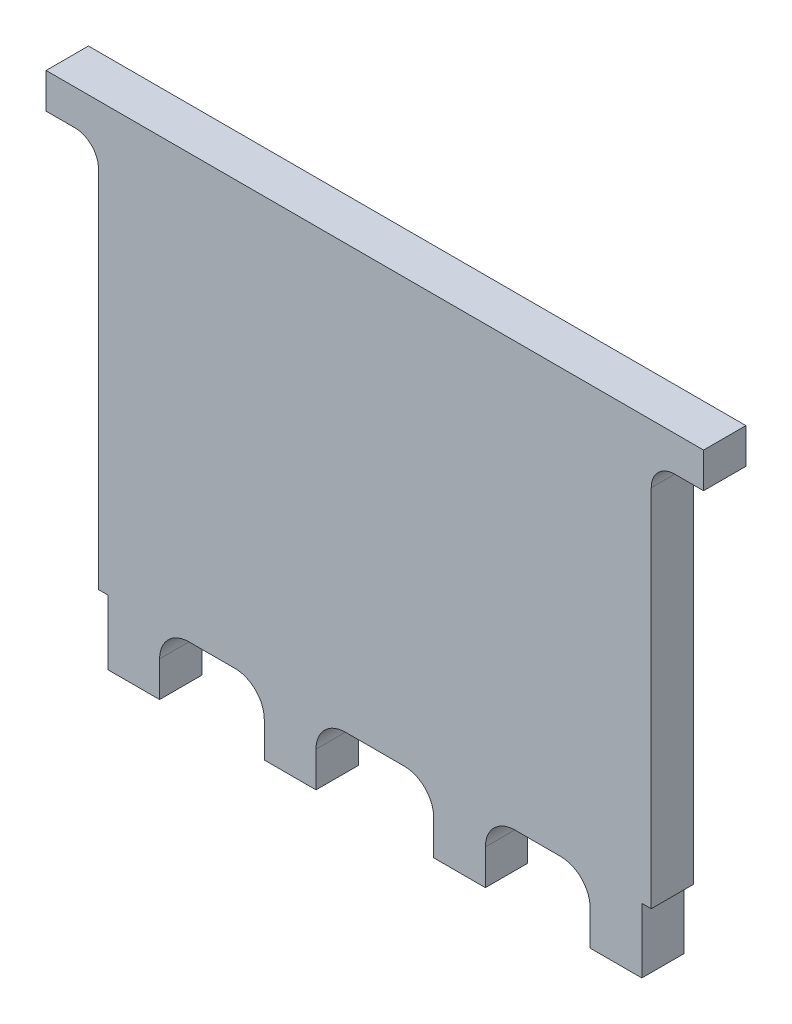
ISO-10303-21;
HEADER;
FILE_DESCRIPTION(('STEP AP214'),'2;1');
FILE_NAME('part.step','',(''),(''),'','','');
FILE_SCHEMA(('AUTOMOTIVE_DESIGN { 1 0 10303 214 1 1 1 1 }'));
ENDSEC;
DATA;
#1=APPLICATION_CONTEXT('core data for automotive mechanical design processes');
#2=APPLICATION_PROTOCOL_DEFINITION('international standard','automotive_design',2000,#1);
#3=PRODUCT_CONTEXT('',#1,'mechanical');
#4=PRODUCT('Part','Part','',(#3));
#5=PRODUCT_RELATED_PRODUCT_CATEGORY('part','',(#4));
#6=PRODUCT_DEFINITION_FORMATION('','',#4);
#7=PRODUCT_DEFINITION_CONTEXT('part definition',#1,'design');
#8=PRODUCT_DEFINITION('design','',#6,#7);
#9=PRODUCT_DEFINITION_SHAPE('','',#8);
#10=(LENGTH_UNIT() NAMED_UNIT(*) SI_UNIT(.MILLI.,.METRE.));
#11=(NAMED_UNIT(*) PLANE_ANGLE_UNIT() SI_UNIT($,.RADIAN.));
#12=(NAMED_UNIT(*) SI_UNIT($,.STERADIAN.) SOLID_ANGLE_UNIT());
#13=UNCERTAINTY_MEASURE_WITH_UNIT(LENGTH_MEASURE(1.E-05),#10,'distance_accuracy_value','');
#14=(GEOMETRIC_REPRESENTATION_CONTEXT(3) GLOBAL_UNCERTAINTY_ASSIGNED_CONTEXT((#13)) GLOBAL_UNIT_ASSIGNED_CONTEXT((#10,
#11,#12)) REPRESENTATION_CONTEXT('',''));
#15=CARTESIAN_POINT('',(0.,0.,0.));
#16=DIRECTION('',(0.,0.,1.));
#17=DIRECTION('',(1.,0.,0.));
#18=AXIS2_PLACEMENT_3D('',#15,#16,#17);
#19=CARTESIAN_POINT('',(2.55,0.975,-0.01));
#20=DIRECTION('',(0.,0.,1.));
#21=DIRECTION('',(1.,0.,0.));
#22=AXIS2_PLACEMENT_3D('',#19,#20,#21);
#23=PLANE('',#22);
#24=DIRECTION('',(0.,-1.,0.));
#25=VECTOR('',#24,1.);
#26=CARTESIAN_POINT('',(2.795,1.475,-0.01));
#27=LINE('',#26,#25);
#28=CARTESIAN_POINT('',(2.795,1.475,-0.01));
#29=VERTEX_POINT('',#28);
#30=CARTESIAN_POINT('',(2.795,1.175,-0.01));
#31=VERTEX_POINT('',#30);
#32=EDGE_CURVE('E236',#29,#31,#27,.T.);
#33=ORIENTED_EDGE('',*,*,#32,.T.);
#34=DIRECTION('',(1.,0.,0.));
#35=VECTOR('',#34,1.);
#36=CARTESIAN_POINT('',(2.55,1.175,-0.01));
#37=LINE('',#36,#35);
#38=CARTESIAN_POINT('',(2.55,1.175,-0.01));
#39=VERTEX_POINT('',#38);
#40=EDGE_CURVE('E228',#39,#31,#37,.T.);
#41=ORIENTED_EDGE('',*,*,#40,.F.);
#42=CARTESIAN_POINT('',(2.55,0.975,-0.01));
#43=DIRECTION('',(0.,0.,1.));
#44=DIRECTION('',(1.,0.,0.));
#45=AXIS2_PLACEMENT_3D('',#42,#43,#44);
#46=CIRCLE('',#45,0.2);
#47=CARTESIAN_POINT('',(2.35,0.975,-0.01));
#48=VERTEX_POINT('',#47);
#49=EDGE_CURVE('E19',#48,#39,#46,.F.);
#50=ORIENTED_EDGE('',*,*,#49,.F.);
#51=DIRECTION('',(0.,-1.,0.));
#52=VECTOR('',#51,1.);
#53=CARTESIAN_POINT('',(2.35,0.975,-0.01));
#54=LINE('',#53,#52);
#55=CARTESIAN_POINT('',(2.35,-2.125,-0.01));
#56=VERTEX_POINT('',#55);
#57=EDGE_CURVE('E153',#48,#56,#54,.T.);
#58=ORIENTED_EDGE('',*,*,#57,.T.);
#59=DIRECTION('',(1.,0.,0.));
#60=VECTOR('',#59,1.);
#61=CARTESIAN_POINT('',(2.27,-2.125,-0.01));
#62=LINE('',#61,#60);
#63=CARTESIAN_POINT('',(2.27,-2.125,-0.01));
#64=VERTEX_POINT('',#63);
#65=EDGE_CURVE('E427',#56,#64,#62,.F.);
#66=ORIENTED_EDGE('',*,*,#65,.T.);
#67=DIRECTION('',(0.,1.,0.));
#68=VECTOR('',#67,1.);
#69=CARTESIAN_POINT('',(2.27,-2.675,-0.01));
#70=LINE('',#69,#68);
#71=CARTESIAN_POINT('',(2.27,-2.675,-0.01));
#72=VERTEX_POINT('',#71);
#73=EDGE_CURVE('E246',#64,#72,#70,.F.);
#74=ORIENTED_EDGE('',*,*,#73,.T.);
#75=DIRECTION('',(1.,0.,0.));
#76=VECTOR('',#75,1.);
#77=CARTESIAN_POINT('',(2.27,-2.675,-0.01));
#78=LINE('',#77,#76);
#79=CARTESIAN_POINT('',(1.83,-2.675,-0.01));
#80=VERTEX_POINT('',#79);
#81=EDGE_CURVE('E252',#72,#80,#78,.F.);
#82=ORIENTED_EDGE('',*,*,#81,.T.);
#83=DIRECTION('',(0.,1.,0.));
#84=VECTOR('',#83,1.);
#85=CARTESIAN_POINT('',(1.83,-2.675,-0.01));
#86=LINE('',#85,#84);
#87=CARTESIAN_POINT('',(1.83,-2.375,-0.01));
#88=VERTEX_POINT('',#87);
#89=EDGE_CURVE('E257',#80,#88,#86,.T.);
#90=ORIENTED_EDGE('',*,*,#89,.T.);
#91=CARTESIAN_POINT('',(1.58,-2.375,-0.01));
#92=DIRECTION('',(0.,0.,1.));
#93=DIRECTION('',(1.,0.,0.));
#94=AXIS2_PLACEMENT_3D('',#91,#92,#93);
#95=CIRCLE('',#94,0.25);
#96=CARTESIAN_POINT('',(1.58,-2.125,-0.01));
#97=VERTEX_POINT('',#96);
#98=EDGE_CURVE('E380',#88,#97,#95,.T.);
#99=ORIENTED_EDGE('',*,*,#98,.T.);
#100=DIRECTION('',(-1.,0.,0.));
#101=VECTOR('',#100,1.);
#102=CARTESIAN_POINT('',(1.58,-2.125,-0.01));
#103=LINE('',#102,#101);
#104=CARTESIAN_POINT('',(1.19,-2.125,-0.01));
#105=VERTEX_POINT('',#104);
#106=EDGE_CURVE('E262',#97,#105,#103,.T.);
#107=ORIENTED_EDGE('',*,*,#106,.T.);
#108=CARTESIAN_POINT('',(1.19,-2.375,-0.01));
#109=DIRECTION('',(0.,0.,1.));
#110=DIRECTION('',(1.,0.,0.));
#111=AXIS2_PLACEMENT_3D('',#108,#109,#110);
#112=CIRCLE('',#111,0.25);
#113=CARTESIAN_POINT('',(0.94,-2.375,-0.01));
#114=VERTEX_POINT('',#113);
#115=EDGE_CURVE('E382',#105,#114,#112,.T.);
#116=ORIENTED_EDGE('',*,*,#115,.T.);
#117=DIRECTION('',(0.,1.,0.));
#118=VECTOR('',#117,1.);
#119=CARTESIAN_POINT('',(0.94,-2.375,-0.01));
#120=LINE('',#119,#118);
#121=CARTESIAN_POINT('',(0.94,-2.675,-0.01));
#122=VERTEX_POINT('',#121);
#123=EDGE_CURVE('E266',#114,#122,#120,.F.);
#124=ORIENTED_EDGE('',*,*,#123,.T.);
#125=DIRECTION('',(1.,0.,0.));
#126=VECTOR('',#125,1.);
#127=CARTESIAN_POINT('',(0.94,-2.675,-0.01));
#128=LINE('',#127,#126);
#129=CARTESIAN_POINT('',(0.5,-2.675,-0.01));
#130=VERTEX_POINT('',#129);
#131=EDGE_CURVE('E272',#122,#130,#128,.F.);
#132=ORIENTED_EDGE('',*,*,#131,.T.);
#133=DIRECTION('',(0.,1.,0.));
#134=VECTOR('',#133,1.);
#135=CARTESIAN_POINT('',(0.5,-2.675,-0.01));
#136=LINE('',#135,#134);
#137=CARTESIAN_POINT('',(0.5,-2.375,-0.01));
#138=VERTEX_POINT('',#137);
#139=EDGE_CURVE('E277',#130,#138,#136,.T.);
#140=ORIENTED_EDGE('',*,*,#139,.T.);
#141=CARTESIAN_POINT('',(0.25,-2.375,-0.01));
#142=DIRECTION('',(0.,0.,1.));
#143=DIRECTION('',(1.,0.,0.));
#144=AXIS2_PLACEMENT_3D('',#141,#142,#143);
#145=CIRCLE('',#144,0.25);
#146=CARTESIAN_POINT('',(0.25,-2.125,-0.01));
#147=VERTEX_POINT('',#146);
#148=EDGE_CURVE('E384',#138,#147,#145,.T.);
#149=ORIENTED_EDGE('',*,*,#148,.T.);
#150=DIRECTION('',(1.,0.,0.));
#151=VECTOR('',#150,1.);
#152=CARTESIAN_POINT('',(0.25,-2.125,-0.01));
#153=LINE('',#152,#151);
#154=CARTESIAN_POINT('',(-0.25,-2.125,-0.01));
#155=VERTEX_POINT('',#154);
#156=EDGE_CURVE('E282',#147,#155,#153,.F.);
#157=ORIENTED_EDGE('',*,*,#156,.T.);
#158=CARTESIAN_POINT('',(-0.25,-2.375,-0.01));
#159=DIRECTION('',(0.,0.,1.));
#160=DIRECTION('',(1.,0.,0.));
#161=AXIS2_PLACEMENT_3D('',#158,#159,#160);
#162=CIRCLE('',#161,0.25);
#163=CARTESIAN_POINT('',(-0.5,-2.375,-0.01));
#164=VERTEX_POINT('',#163);
#165=EDGE_CURVE('E386',#155,#164,#162,.T.);
#166=ORIENTED_EDGE('',*,*,#165,.T.);
#167=DIRECTION('',(0.,-1.,0.));
#168=VECTOR('',#167,1.);
#169=CARTESIAN_POINT('',(-0.5,-2.375,-0.01));
#170=LINE('',#169,#168);
#171=CARTESIAN_POINT('',(-0.5,-2.675,-0.01));
#172=VERTEX_POINT('',#171);
#173=EDGE_CURVE('E286',#164,#172,#170,.T.);
#174=ORIENTED_EDGE('',*,*,#173,.T.);
#175=DIRECTION('',(1.,0.,0.));
#176=VECTOR('',#175,1.);
#177=CARTESIAN_POINT('',(-0.5,-2.675,-0.01));
#178=LINE('',#177,#176);
#179=CARTESIAN_POINT('',(-0.94,-2.675,-0.01));
#180=VERTEX_POINT('',#179);
#181=EDGE_CURVE('E292',#172,#180,#178,.F.);
#182=ORIENTED_EDGE('',*,*,#181,.T.);
#183=DIRECTION('',(0.,1.,0.));
#184=VECTOR('',#183,1.);
#185=CARTESIAN_POINT('',(-0.94,-2.675,-0.01));
#186=LINE('',#185,#184);
#187=CARTESIAN_POINT('',(-0.94,-2.375,-0.01));
#188=VERTEX_POINT('',#187);
#189=EDGE_CURVE('E297',#180,#188,#186,.T.);
#190=ORIENTED_EDGE('',*,*,#189,.T.);
#191=CARTESIAN_POINT('',(-1.19,-2.375,-0.01));
#192=DIRECTION('',(0.,0.,1.));
#193=DIRECTION('',(1.,0.,0.));
#194=AXIS2_PLACEMENT_3D('',#191,#192,#193);
#195=CIRCLE('',#194,0.25);
#196=CARTESIAN_POINT('',(-1.19,-2.125,-0.01));
#197=VERTEX_POINT('',#196);
#198=EDGE_CURVE('E388',#188,#197,#195,.T.);
#199=ORIENTED_EDGE('',*,*,#198,.T.);
#200=DIRECTION('',(1.,0.,0.));
#201=VECTOR('',#200,1.);
#202=CARTESIAN_POINT('',(-1.19,-2.125,-0.01));
#203=LINE('',#202,#201);
#204=CARTESIAN_POINT('',(-1.58,-2.125,-0.01));
#205=VERTEX_POINT('',#204);
#206=EDGE_CURVE('E302',#197,#205,#203,.F.);
#207=ORIENTED_EDGE('',*,*,#206,.T.);
#208=CARTESIAN_POINT('',(-1.58,-2.375,-0.01));
#209=DIRECTION('',(0.,0.,1.));
#210=DIRECTION('',(1.,0.,0.));
#211=AXIS2_PLACEMENT_3D('',#208,#209,#210);
#212=CIRCLE('',#211,0.25);
#213=CARTESIAN_POINT('',(-1.83,-2.375,-0.01));
#214=VERTEX_POINT('',#213);
#215=EDGE_CURVE('E390',#205,#214,#212,.T.);
#216=ORIENTED_EDGE('',*,*,#215,.T.);
#217=DIRECTION('',(0.,-1.,0.));
#218=VECTOR('',#217,1.);
#219=CARTESIAN_POINT('',(-1.83,-2.375,-0.01));
#220=LINE('',#219,#218);
#221=CARTESIAN_POINT('',(-1.83,-2.675,-0.01));
#222=VERTEX_POINT('',#221);
#223=EDGE_CURVE('E306',#214,#222,#220,.T.);
#224=ORIENTED_EDGE('',*,*,#223,.T.);
#225=DIRECTION('',(1.,0.,0.));
#226=VECTOR('',#225,1.);
#227=CARTESIAN_POINT('',(-1.83,-2.675,-0.01));
#228=LINE('',#227,#226);
#229=CARTESIAN_POINT('',(-2.27,-2.675,-0.01));
#230=VERTEX_POINT('',#229);
#231=EDGE_CURVE('E312',#222,#230,#228,.F.);
#232=ORIENTED_EDGE('',*,*,#231,.T.);
#233=DIRECTION('',(0.,1.,0.));
#234=VECTOR('',#233,1.);
#235=CARTESIAN_POINT('',(-2.27,-2.675,-0.01));
#236=LINE('',#235,#234);
#237=CARTESIAN_POINT('',(-2.27,-2.125,-0.01));
#238=VERTEX_POINT('',#237);
#239=EDGE_CURVE('E317',#230,#238,#236,.T.);
#240=ORIENTED_EDGE('',*,*,#239,.T.);
#241=DIRECTION('',(-1.,0.,0.));
#242=VECTOR('',#241,1.);
#243=CARTESIAN_POINT('',(-2.27,-2.125,-0.01));
#244=LINE('',#243,#242);
#245=CARTESIAN_POINT('',(-2.35,-2.125,-0.01));
#246=VERTEX_POINT('',#245);
#247=EDGE_CURVE('E322',#238,#246,#244,.T.);
#248=ORIENTED_EDGE('',*,*,#247,.T.);
#249=DIRECTION('',(0.,1.,0.));
#250=VECTOR('',#249,1.);
#251=CARTESIAN_POINT('',(-2.35,-2.125,-0.01));
#252=LINE('',#251,#250);
#253=CARTESIAN_POINT('',(-2.35,0.975,-0.01));
#254=VERTEX_POINT('',#253);
#255=EDGE_CURVE('E327',#246,#254,#252,.T.);
#256=ORIENTED_EDGE('',*,*,#255,.T.);
#257=CARTESIAN_POINT('',(-2.55,0.975,-0.01));
#258=DIRECTION('',(0.,0.,1.));
#259=DIRECTION('',(1.,0.,0.));
#260=AXIS2_PLACEMENT_3D('',#257,#258,#259);
#261=CIRCLE('',#260,0.2);
#262=CARTESIAN_POINT('',(-2.55,1.175,-0.01));
#263=VERTEX_POINT('',#262);
#264=EDGE_CURVE('E391',#254,#263,#261,.T.);
#265=ORIENTED_EDGE('',*,*,#264,.T.);
#266=DIRECTION('',(-1.,0.,0.));
#267=VECTOR('',#266,1.);
#268=CARTESIAN_POINT('',(-2.55,1.175,-0.01));
#269=LINE('',#268,#267);
#270=CARTESIAN_POINT('',(-2.795,1.175,-0.01));
#271=VERTEX_POINT('',#270);
#272=EDGE_CURVE('E332',#263,#271,#269,.T.);
#273=ORIENTED_EDGE('',*,*,#272,.T.);
#274=DIRECTION('',(0.,1.,0.));
#275=VECTOR('',#274,1.);
#276=CARTESIAN_POINT('',(-2.795,1.175,-0.01));
#277=LINE('',#276,#275);
#278=CARTESIAN_POINT('',(-2.795,1.475,-0.01));
#279=VERTEX_POINT('',#278);
#280=EDGE_CURVE('E338',#271,#279,#277,.T.);
#281=ORIENTED_EDGE('',*,*,#280,.T.);
#282=DIRECTION('',(1.,0.,0.));
#283=VECTOR('',#282,1.);
#284=CARTESIAN_POINT('',(-2.795,1.475,-0.01));
#285=LINE('',#284,#283);
#286=EDGE_CURVE('E223',#279,#29,#285,.T.);
#287=ORIENTED_EDGE('',*,*,#286,.T.);
#288=EDGE_LOOP('',(#33,#41,#50,#58,#66,#74,#82,#90,#99,#107,#116,#124,#132,#140,#149,#157,#166,
#174,#182,#190,#199,#207,#216,#224,#232,#240,#248,#256,#265,#273,#281,#287));
#289=FACE_BOUND('',#288,.T.);
#290=ADVANCED_FACE('F16',(#289),#23,.F.);
#291=CARTESIAN_POINT('',(2.795,1.475,-0.01));
#292=DIRECTION('',(-1.,0.,0.));
#293=DIRECTION('',(0.,-1.,0.));
#294=AXIS2_PLACEMENT_3D('',#291,#292,#293);
#295=PLANE('',#294);
#296=DIRECTION('',(0.,0.,1.));
#297=VECTOR('',#296,1.);
#298=CARTESIAN_POINT('',(2.795,1.175,-0.01));
#299=LINE('',#298,#297);
#300=CARTESIAN_POINT('',(2.795,1.175,0.35));
#301=VERTEX_POINT('',#300);
#302=EDGE_CURVE('E234',#301,#31,#299,.F.);
#303=ORIENTED_EDGE('',*,*,#302,.T.);
#304=ORIENTED_EDGE('',*,*,#32,.F.);
#305=DIRECTION('',(0.,0.,-1.));
#306=VECTOR('',#305,1.);
#307=CARTESIAN_POINT('',(2.795,1.475,-0.01));
#308=LINE('',#307,#306);
#309=CARTESIAN_POINT('',(2.795,1.475,0.35));
#310=VERTEX_POINT('',#309);
#311=EDGE_CURVE('E340',#29,#310,#308,.F.);
#312=ORIENTED_EDGE('',*,*,#311,.T.);
#313=DIRECTION('',(0.,1.,0.));
#314=VECTOR('',#313,1.);
#315=CARTESIAN_POINT('',(2.795,0.975,0.35));
#316=LINE('',#315,#314);
#317=EDGE_CURVE('E233',#301,#310,#316,.T.);
#318=ORIENTED_EDGE('',*,*,#317,.F.);
#319=EDGE_LOOP('',(#303,#304,#312,#318));
#320=FACE_BOUND('',#319,.T.);
#321=ADVANCED_FACE('F935',(#320),#295,.F.);
#322=CARTESIAN_POINT('',(-2.795,1.475,-0.01));
#323=DIRECTION('',(0.,-1.,0.));
#324=DIRECTION('',(0.,0.,-1.));
#325=AXIS2_PLACEMENT_3D('',#322,#323,#324);
#326=PLANE('',#325);
#327=ORIENTED_EDGE('',*,*,#311,.F.);
#328=ORIENTED_EDGE('',*,*,#286,.F.);
#329=DIRECTION('',(0.,0.,1.));
#330=VECTOR('',#329,1.);
#331=CARTESIAN_POINT('',(-2.795,1.475,-0.01));
#332=LINE('',#331,#330);
#333=CARTESIAN_POINT('',(-2.795,1.475,0.35));
#334=VERTEX_POINT('',#333);
#335=EDGE_CURVE('E335',#279,#334,#332,.T.);
#336=ORIENTED_EDGE('',*,*,#335,.T.);
#337=DIRECTION('',(1.,0.,0.));
#338=VECTOR('',#337,1.);
#339=CARTESIAN_POINT('',(2.55,1.475,0.35));
#340=LINE('',#339,#338);
#341=EDGE_CURVE('E408',#310,#334,#340,.F.);
#342=ORIENTED_EDGE('',*,*,#341,.F.);
#343=EDGE_LOOP('',(#327,#328,#336,#342));
#344=FACE_BOUND('',#343,.T.);
#345=ADVANCED_FACE('F927',(#344),#326,.F.);
#346=CARTESIAN_POINT('',(-2.795,1.175,-0.01));
#347=DIRECTION('',(1.,0.,0.));
#348=DIRECTION('',(0.,1.,0.));
#349=AXIS2_PLACEMENT_3D('',#346,#347,#348);
#350=PLANE('',#349);
#351=ORIENTED_EDGE('',*,*,#335,.F.);
#352=ORIENTED_EDGE('',*,*,#280,.F.);
#353=DIRECTION('',(0.,0.,1.));
#354=VECTOR('',#353,1.);
#355=CARTESIAN_POINT('',(-2.795,1.175,-0.01));
#356=LINE('',#355,#354);
#357=CARTESIAN_POINT('',(-2.795,1.175,0.35));
#358=VERTEX_POINT('',#357);
#359=EDGE_CURVE('E334',#271,#358,#356,.T.);
#360=ORIENTED_EDGE('',*,*,#359,.T.);
#361=DIRECTION('',(0.,1.,0.));
#362=VECTOR('',#361,1.);
#363=CARTESIAN_POINT('',(-2.795,0.975,0.35));
#364=LINE('',#363,#362);
#365=EDGE_CURVE('E405',#334,#358,#364,.F.);
#366=ORIENTED_EDGE('',*,*,#365,.F.);
#367=EDGE_LOOP('',(#351,#352,#360,#366));
#368=FACE_BOUND('',#367,.T.);
#369=ADVANCED_FACE('F919',(#368),#350,.F.);
#370=CARTESIAN_POINT('',(-2.55,1.175,-0.01));
#371=DIRECTION('',(0.,1.,0.));
#372=DIRECTION('',(-1.,0.,0.));
#373=AXIS2_PLACEMENT_3D('',#370,#371,#372);
#374=PLANE('',#373);
#375=ORIENTED_EDGE('',*,*,#359,.F.);
#376=ORIENTED_EDGE('',*,*,#272,.F.);
#377=DIRECTION('',(0.,0.,1.));
#378=VECTOR('',#377,1.);
#379=CARTESIAN_POINT('',(-2.55,1.175,-0.01));
#380=LINE('',#379,#378);
#381=CARTESIAN_POINT('',(-2.55,1.175,0.35));
#382=VERTEX_POINT('',#381);
#383=EDGE_CURVE('E329',#263,#382,#380,.T.);
#384=ORIENTED_EDGE('',*,*,#383,.T.);
#385=DIRECTION('',(1.,0.,0.));
#386=VECTOR('',#385,1.);
#387=CARTESIAN_POINT('',(2.55,1.175,0.35));
#388=LINE('',#387,#386);
#389=EDGE_CURVE('E379',#358,#382,#388,.T.);
#390=ORIENTED_EDGE('',*,*,#389,.F.);
#391=EDGE_LOOP('',(#375,#376,#384,#390));
#392=FACE_BOUND('',#391,.T.);
#393=ADVANCED_FACE('F911',(#392),#374,.F.);
#394=CARTESIAN_POINT('',(-2.55,0.975,-0.01));
#395=DIRECTION('',(0.,0.,1.));
#396=DIRECTION('',(1.,0.,0.));
#397=AXIS2_PLACEMENT_3D('',#394,#395,#396);
#398=CYLINDRICAL_SURFACE('',#397,0.2);
#399=ORIENTED_EDGE('',*,*,#383,.F.);
#400=ORIENTED_EDGE('',*,*,#264,.F.);
#401=DIRECTION('',(0.,0.,1.));
#402=VECTOR('',#401,1.);
#403=CARTESIAN_POINT('',(-2.35,0.975,-0.01));
#404=LINE('',#403,#402);
#405=CARTESIAN_POINT('',(-2.35,0.975,0.35));
#406=VERTEX_POINT('',#405);
#407=EDGE_CURVE('E324',#254,#406,#404,.T.);
#408=ORIENTED_EDGE('',*,*,#407,.T.);
#409=CARTESIAN_POINT('',(-2.55,0.975,0.35));
#410=DIRECTION('',(0.,0.,1.));
#411=DIRECTION('',(1.,0.,0.));
#412=AXIS2_PLACEMENT_3D('',#409,#410,#411);
#413=CIRCLE('',#412,0.2);
#414=EDGE_CURVE('E375',#382,#406,#413,.F.);
#415=ORIENTED_EDGE('',*,*,#414,.F.);
#416=EDGE_LOOP('',(#399,#400,#408,#415));
#417=FACE_BOUND('',#416,.T.);
#418=ADVANCED_FACE('F517',(#417),#398,.F.);
#419=CARTESIAN_POINT('',(-2.35,-2.125,-0.01));
#420=DIRECTION('',(1.,0.,0.));
#421=DIRECTION('',(0.,1.,0.));
#422=AXIS2_PLACEMENT_3D('',#419,#420,#421);
#423=PLANE('',#422);
#424=ORIENTED_EDGE('',*,*,#407,.F.);
#425=ORIENTED_EDGE('',*,*,#255,.F.);
#426=DIRECTION('',(0.,0.,1.));
#427=VECTOR('',#426,1.);
#428=CARTESIAN_POINT('',(-2.35,-2.125,-0.01));
#429=LINE('',#428,#427);
#430=CARTESIAN_POINT('',(-2.35,-2.125,0.35));
#431=VERTEX_POINT('',#430);
#432=EDGE_CURVE('E319',#246,#431,#429,.T.);
#433=ORIENTED_EDGE('',*,*,#432,.T.);
#434=DIRECTION('',(0.,1.,0.));
#435=VECTOR('',#434,1.);
#436=CARTESIAN_POINT('',(-2.35,0.975,0.35));
#437=LINE('',#436,#435);
#438=EDGE_CURVE('E378',#406,#431,#437,.F.);
#439=ORIENTED_EDGE('',*,*,#438,.F.);
#440=EDGE_LOOP('',(#424,#425,#433,#439));
#441=FACE_BOUND('',#440,.T.);
#442=ADVANCED_FACE('F522',(#441),#423,.F.);
#443=CARTESIAN_POINT('',(-2.27,-2.125,-0.01));
#444=DIRECTION('',(0.,1.,0.));
#445=DIRECTION('',(-1.,0.,0.));
#446=AXIS2_PLACEMENT_3D('',#443,#444,#445);
#447=PLANE('',#446);
#448=ORIENTED_EDGE('',*,*,#432,.F.);
#449=ORIENTED_EDGE('',*,*,#247,.F.);
#450=DIRECTION('',(0.,0.,-1.));
#451=VECTOR('',#450,1.);
#452=CARTESIAN_POINT('',(-2.27,-2.125,-0.01));
#453=LINE('',#452,#451);
#454=CARTESIAN_POINT('',(-2.27,-2.125,0.35));
#455=VERTEX_POINT('',#454);
#456=EDGE_CURVE('E314',#238,#455,#453,.F.);
#457=ORIENTED_EDGE('',*,*,#456,.T.);
#458=DIRECTION('',(1.,0.,0.));
#459=VECTOR('',#458,1.);
#460=CARTESIAN_POINT('',(2.55,-2.125,0.35));
#461=LINE('',#460,#459);
#462=EDGE_CURVE('E500',#431,#455,#461,.T.);
#463=ORIENTED_EDGE('',*,*,#462,.F.);
#464=EDGE_LOOP('',(#448,#449,#457,#463));
#465=FACE_BOUND('',#464,.T.);
#466=ADVANCED_FACE('F887',(#465),#447,.F.);
#467=CARTESIAN_POINT('',(-2.27,-2.675,-0.01));
#468=DIRECTION('',(1.,0.,0.));
#469=DIRECTION('',(0.,0.,-1.));
#470=AXIS2_PLACEMENT_3D('',#467,#468,#469);
#471=PLANE('',#470);
#472=ORIENTED_EDGE('',*,*,#456,.F.);
#473=ORIENTED_EDGE('',*,*,#239,.F.);
#474=DIRECTION('',(0.,0.,1.));
#475=VECTOR('',#474,1.);
#476=CARTESIAN_POINT('',(-2.27,-2.675,-0.01));
#477=LINE('',#476,#475);
#478=CARTESIAN_POINT('',(-2.27,-2.675,0.35));
#479=VERTEX_POINT('',#478);
#480=EDGE_CURVE('E309',#230,#479,#477,.T.);
#481=ORIENTED_EDGE('',*,*,#480,.T.);
#482=DIRECTION('',(0.,1.,0.));
#483=VECTOR('',#482,1.);
#484=CARTESIAN_POINT('',(-2.27,0.975,0.35));
#485=LINE('',#484,#483);
#486=EDGE_CURVE('E492',#455,#479,#485,.F.);
#487=ORIENTED_EDGE('',*,*,#486,.F.);
#488=EDGE_LOOP('',(#472,#473,#481,#487));
#489=FACE_BOUND('',#488,.T.);
#490=ADVANCED_FACE('F878',(#489),#471,.F.);
#491=CARTESIAN_POINT('',(-1.83,-2.675,-0.01));
#492=DIRECTION('',(0.,1.,0.));
#493=DIRECTION('',(0.,0.,1.));
#494=AXIS2_PLACEMENT_3D('',#491,#492,#493);
#495=PLANE('',#494);
#496=ORIENTED_EDGE('',*,*,#480,.F.);
#497=ORIENTED_EDGE('',*,*,#231,.F.);
#498=DIRECTION('',(0.,0.,1.));
#499=VECTOR('',#498,1.);
#500=CARTESIAN_POINT('',(-1.83,-2.675,-0.01));
#501=LINE('',#500,#499);
#502=CARTESIAN_POINT('',(-1.83,-2.675,0.35));
#503=VERTEX_POINT('',#502);
#504=EDGE_CURVE('E308',#222,#503,#501,.T.);
#505=ORIENTED_EDGE('',*,*,#504,.T.);
#506=DIRECTION('',(1.,0.,0.));
#507=VECTOR('',#506,1.);
#508=CARTESIAN_POINT('',(2.55,-2.675,0.35));
#509=LINE('',#508,#507);
#510=EDGE_CURVE('E489',#479,#503,#509,.T.);
#511=ORIENTED_EDGE('',*,*,#510,.F.);
#512=EDGE_LOOP('',(#496,#497,#505,#511));
#513=FACE_BOUND('',#512,.T.);
#514=ADVANCED_FACE('F870',(#513),#495,.F.);
#515=CARTESIAN_POINT('',(-1.83,-2.375,-0.01));
#516=DIRECTION('',(-1.,0.,0.));
#517=DIRECTION('',(0.,-1.,0.));
#518=AXIS2_PLACEMENT_3D('',#515,#516,#517);
#519=PLANE('',#518);
#520=ORIENTED_EDGE('',*,*,#504,.F.);
#521=ORIENTED_EDGE('',*,*,#223,.F.);
#522=DIRECTION('',(0.,0.,1.));
#523=VECTOR('',#522,1.);
#524=CARTESIAN_POINT('',(-1.83,-2.375,-0.01));
#525=LINE('',#524,#523);
#526=CARTESIAN_POINT('',(-1.83,-2.375,0.35));
#527=VERTEX_POINT('',#526);
#528=EDGE_CURVE('E305',#214,#527,#525,.T.);
#529=ORIENTED_EDGE('',*,*,#528,.T.);
#530=DIRECTION('',(0.,1.,0.));
#531=VECTOR('',#530,1.);
#532=CARTESIAN_POINT('',(-1.83,0.975,0.35));
#533=LINE('',#532,#531);
#534=EDGE_CURVE('E374',#503,#527,#533,.T.);
#535=ORIENTED_EDGE('',*,*,#534,.F.);
#536=EDGE_LOOP('',(#520,#521,#529,#535));
#537=FACE_BOUND('',#536,.T.);
#538=ADVANCED_FACE('F605',(#537),#519,.F.);
#539=CARTESIAN_POINT('',(-1.58,-2.375,-0.01));
#540=DIRECTION('',(0.,0.,1.));
#541=DIRECTION('',(1.,0.,0.));
#542=AXIS2_PLACEMENT_3D('',#539,#540,#541);
#543=CYLINDRICAL_SURFACE('',#542,0.25);
#544=ORIENTED_EDGE('',*,*,#528,.F.);
#545=ORIENTED_EDGE('',*,*,#215,.F.);
#546=DIRECTION('',(0.,0.,1.));
#547=VECTOR('',#546,1.);
#548=CARTESIAN_POINT('',(-1.58,-2.125,-0.01));
#549=LINE('',#548,#547);
#550=CARTESIAN_POINT('',(-1.58,-2.125,0.35));
#551=VERTEX_POINT('',#550);
#552=EDGE_CURVE('E304',#205,#551,#549,.T.);
#553=ORIENTED_EDGE('',*,*,#552,.T.);
#554=CARTESIAN_POINT('',(-1.58,-2.375,0.35));
#555=DIRECTION('',(0.,0.,1.));
#556=DIRECTION('',(1.,0.,0.));
#557=AXIS2_PLACEMENT_3D('',#554,#555,#556);
#558=CIRCLE('',#557,0.25);
#559=EDGE_CURVE('E371',#527,#551,#558,.F.);
#560=ORIENTED_EDGE('',*,*,#559,.F.);
#561=EDGE_LOOP('',(#544,#545,#553,#560));
#562=FACE_BOUND('',#561,.T.);
#563=ADVANCED_FACE('F610',(#562),#543,.F.);
#564=CARTESIAN_POINT('',(-1.19,-2.125,-0.01));
#565=DIRECTION('',(0.,1.,0.));
#566=DIRECTION('',(0.,0.,1.));
#567=AXIS2_PLACEMENT_3D('',#564,#565,#566);
#568=PLANE('',#567);
#569=ORIENTED_EDGE('',*,*,#552,.F.);
#570=ORIENTED_EDGE('',*,*,#206,.F.);
#571=DIRECTION('',(0.,0.,1.));
#572=VECTOR('',#571,1.);
#573=CARTESIAN_POINT('',(-1.19,-2.125,-0.01));
#574=LINE('',#573,#572);
#575=CARTESIAN_POINT('',(-1.19,-2.125,0.35));
#576=VERTEX_POINT('',#575);
#577=EDGE_CURVE('E299',#197,#576,#574,.T.);
#578=ORIENTED_EDGE('',*,*,#577,.T.);
#579=DIRECTION('',(1.,0.,0.));
#580=VECTOR('',#579,1.);
#581=CARTESIAN_POINT('',(2.55,-2.125,0.35));
#582=LINE('',#581,#580);
#583=EDGE_CURVE('E370',#551,#576,#582,.T.);
#584=ORIENTED_EDGE('',*,*,#583,.F.);
#585=EDGE_LOOP('',(#569,#570,#578,#584));
#586=FACE_BOUND('',#585,.T.);
#587=ADVANCED_FACE('F615',(#586),#568,.F.);
#588=CARTESIAN_POINT('',(-1.19,-2.375,-0.01));
#589=DIRECTION('',(0.,0.,1.));
#590=DIRECTION('',(1.,0.,0.));
#591=AXIS2_PLACEMENT_3D('',#588,#589,#590);
#592=CYLINDRICAL_SURFACE('',#591,0.25);
#593=ORIENTED_EDGE('',*,*,#577,.F.);
#594=ORIENTED_EDGE('',*,*,#198,.F.);
#595=DIRECTION('',(0.,0.,1.));
#596=VECTOR('',#595,1.);
#597=CARTESIAN_POINT('',(-0.94,-2.375,-0.01));
#598=LINE('',#597,#596);
#599=CARTESIAN_POINT('',(-0.94,-2.375,0.35));
#600=VERTEX_POINT('',#599);
#601=EDGE_CURVE('E294',#188,#600,#598,.T.);
#602=ORIENTED_EDGE('',*,*,#601,.T.);
#603=CARTESIAN_POINT('',(-1.19,-2.375,0.35));
#604=DIRECTION('',(0.,0.,1.));
#605=DIRECTION('',(1.,0.,0.));
#606=AXIS2_PLACEMENT_3D('',#603,#604,#605);
#607=CIRCLE('',#606,0.25);
#608=EDGE_CURVE('E366',#576,#600,#607,.F.);
#609=ORIENTED_EDGE('',*,*,#608,.F.);
#610=EDGE_LOOP('',(#593,#594,#602,#609));
#611=FACE_BOUND('',#610,.T.);
#612=ADVANCED_FACE('F620',(#611),#592,.F.);
#613=CARTESIAN_POINT('',(-0.94,-2.675,-0.01));
#614=DIRECTION('',(1.,0.,0.));
#615=DIRECTION('',(0.,1.,0.));
#616=AXIS2_PLACEMENT_3D('',#613,#614,#615);
#617=PLANE('',#616);
#618=ORIENTED_EDGE('',*,*,#601,.F.);
#619=ORIENTED_EDGE('',*,*,#189,.F.);
#620=DIRECTION('',(0.,0.,1.));
#621=VECTOR('',#620,1.);
#622=CARTESIAN_POINT('',(-0.94,-2.675,-0.01));
#623=LINE('',#622,#621);
#624=CARTESIAN_POINT('',(-0.94,-2.675,0.35));
#625=VERTEX_POINT('',#624);
#626=EDGE_CURVE('E289',#180,#625,#623,.T.);
#627=ORIENTED_EDGE('',*,*,#626,.T.);
#628=DIRECTION('',(0.,1.,0.));
#629=VECTOR('',#628,1.);
#630=CARTESIAN_POINT('',(-0.94,0.975,0.35));
#631=LINE('',#630,#629);
#632=EDGE_CURVE('E369',#600,#625,#631,.F.);
#633=ORIENTED_EDGE('',*,*,#632,.F.);
#634=EDGE_LOOP('',(#618,#619,#627,#633));
#635=FACE_BOUND('',#634,.T.);
#636=ADVANCED_FACE('F625',(#635),#617,.F.);
#637=CARTESIAN_POINT('',(-0.5,-2.675,-0.01));
#638=DIRECTION('',(0.,1.,0.));
#639=DIRECTION('',(0.,0.,1.));
#640=AXIS2_PLACEMENT_3D('',#637,#638,#639);
#641=PLANE('',#640);
#642=ORIENTED_EDGE('',*,*,#626,.F.);
#643=ORIENTED_EDGE('',*,*,#181,.F.);
#644=DIRECTION('',(0.,0.,1.));
#645=VECTOR('',#644,1.);
#646=CARTESIAN_POINT('',(-0.5,-2.675,-0.01));
#647=LINE('',#646,#645);
#648=CARTESIAN_POINT('',(-0.5,-2.675,0.35));
#649=VERTEX_POINT('',#648);
#650=EDGE_CURVE('E288',#172,#649,#647,.T.);
#651=ORIENTED_EDGE('',*,*,#650,.T.);
#652=DIRECTION('',(1.,0.,0.));
#653=VECTOR('',#652,1.);
#654=CARTESIAN_POINT('',(2.55,-2.675,0.35));
#655=LINE('',#654,#653);
#656=EDGE_CURVE('E474',#625,#649,#655,.T.);
#657=ORIENTED_EDGE('',*,*,#656,.F.);
#658=EDGE_LOOP('',(#642,#643,#651,#657));
#659=FACE_BOUND('',#658,.T.);
#660=ADVANCED_FACE('F630',(#659),#641,.F.);
#661=CARTESIAN_POINT('',(-0.5,-2.375,-0.01));
#662=DIRECTION('',(-1.,0.,0.));
#663=DIRECTION('',(0.,-1.,0.));
#664=AXIS2_PLACEMENT_3D('',#661,#662,#663);
#665=PLANE('',#664);
#666=ORIENTED_EDGE('',*,*,#650,.F.);
#667=ORIENTED_EDGE('',*,*,#173,.F.);
#668=DIRECTION('',(0.,0.,1.));
#669=VECTOR('',#668,1.);
#670=CARTESIAN_POINT('',(-0.5,-2.375,-0.01));
#671=LINE('',#670,#669);
#672=CARTESIAN_POINT('',(-0.5,-2.375,0.35));
#673=VERTEX_POINT('',#672);
#674=EDGE_CURVE('E285',#164,#673,#671,.T.);
#675=ORIENTED_EDGE('',*,*,#674,.T.);
#676=DIRECTION('',(0.,1.,0.));
#677=VECTOR('',#676,1.);
#678=CARTESIAN_POINT('',(-0.5,0.975,0.35));
#679=LINE('',#678,#677);
#680=EDGE_CURVE('E365',#649,#673,#679,.T.);
#681=ORIENTED_EDGE('',*,*,#680,.F.);
#682=EDGE_LOOP('',(#666,#667,#675,#681));
#683=FACE_BOUND('',#682,.T.);
#684=ADVANCED_FACE('F635',(#683),#665,.F.);
#685=CARTESIAN_POINT('',(-0.25,-2.375,-0.01));
#686=DIRECTION('',(0.,0.,1.));
#687=DIRECTION('',(1.,0.,0.));
#688=AXIS2_PLACEMENT_3D('',#685,#686,#687);
#689=CYLINDRICAL_SURFACE('',#688,0.25);
#690=ORIENTED_EDGE('',*,*,#674,.F.);
#691=ORIENTED_EDGE('',*,*,#165,.F.);
#692=DIRECTION('',(0.,0.,1.));
#693=VECTOR('',#692,1.);
#694=CARTESIAN_POINT('',(-0.25,-2.125,-0.01));
#695=LINE('',#694,#693);
#696=CARTESIAN_POINT('',(-0.25,-2.125,0.35));
#697=VERTEX_POINT('',#696);
#698=EDGE_CURVE('E284',#155,#697,#695,.T.);
#699=ORIENTED_EDGE('',*,*,#698,.T.);
#700=CARTESIAN_POINT('',(-0.25,-2.375,0.35));
#701=DIRECTION('',(0.,0.,1.));
#702=DIRECTION('',(1.,0.,0.));
#703=AXIS2_PLACEMENT_3D('',#700,#701,#702);
#704=CIRCLE('',#703,0.25);
#705=EDGE_CURVE('E362',#673,#697,#704,.F.);
#706=ORIENTED_EDGE('',*,*,#705,.F.);
#707=EDGE_LOOP('',(#690,#691,#699,#706));
#708=FACE_BOUND('',#707,.T.);
#709=ADVANCED_FACE('F640',(#708),#689,.F.);
#710=CARTESIAN_POINT('',(0.25,-2.125,-0.01));
#711=DIRECTION('',(0.,1.,0.));
#712=DIRECTION('',(0.,0.,1.));
#713=AXIS2_PLACEMENT_3D('',#710,#711,#712);
#714=PLANE('',#713);
#715=ORIENTED_EDGE('',*,*,#698,.F.);
#716=ORIENTED_EDGE('',*,*,#156,.F.);
#717=DIRECTION('',(0.,0.,1.));
#718=VECTOR('',#717,1.);
#719=CARTESIAN_POINT('',(0.25,-2.125,-0.01));
#720=LINE('',#719,#718);
#721=CARTESIAN_POINT('',(0.25,-2.125,0.35));
#722=VERTEX_POINT('',#721);
#723=EDGE_CURVE('E279',#147,#722,#720,.T.);
#724=ORIENTED_EDGE('',*,*,#723,.T.);
#725=DIRECTION('',(1.,0.,0.));
#726=VECTOR('',#725,1.);
#727=CARTESIAN_POINT('',(2.55,-2.125,0.35));
#728=LINE('',#727,#726);
#729=EDGE_CURVE('E361',#697,#722,#728,.T.);
#730=ORIENTED_EDGE('',*,*,#729,.F.);
#731=EDGE_LOOP('',(#715,#716,#724,#730));
#732=FACE_BOUND('',#731,.T.);
#733=ADVANCED_FACE('F645',(#732),#714,.F.);
#734=CARTESIAN_POINT('',(0.25,-2.375,-0.01));
#735=DIRECTION('',(0.,0.,1.));
#736=DIRECTION('',(1.,0.,0.));
#737=AXIS2_PLACEMENT_3D('',#734,#735,#736);
#738=CYLINDRICAL_SURFACE('',#737,0.25);
#739=ORIENTED_EDGE('',*,*,#723,.F.);
#740=ORIENTED_EDGE('',*,*,#148,.F.);
#741=DIRECTION('',(0.,0.,1.));
#742=VECTOR('',#741,1.);
#743=CARTESIAN_POINT('',(0.5,-2.375,-0.01));
#744=LINE('',#743,#742);
#745=CARTESIAN_POINT('',(0.5,-2.375,0.35));
#746=VERTEX_POINT('',#745);
#747=EDGE_CURVE('E274',#138,#746,#744,.T.);
#748=ORIENTED_EDGE('',*,*,#747,.T.);
#749=CARTESIAN_POINT('',(0.25,-2.375,0.35));
#750=DIRECTION('',(0.,0.,1.));
#751=DIRECTION('',(1.,0.,0.));
#752=AXIS2_PLACEMENT_3D('',#749,#750,#751);
#753=CIRCLE('',#752,0.25);
#754=EDGE_CURVE('E357',#722,#746,#753,.F.);
#755=ORIENTED_EDGE('',*,*,#754,.F.);
#756=EDGE_LOOP('',(#739,#740,#748,#755));
#757=FACE_BOUND('',#756,.T.);
#758=ADVANCED_FACE('F650',(#757),#738,.F.);
#759=CARTESIAN_POINT('',(0.5,-2.675,-0.01));
#760=DIRECTION('',(1.,0.,0.));
#761=DIRECTION('',(0.,1.,0.));
#762=AXIS2_PLACEMENT_3D('',#759,#760,#761);
#763=PLANE('',#762);
#764=ORIENTED_EDGE('',*,*,#747,.F.);
#765=ORIENTED_EDGE('',*,*,#139,.F.);
#766=DIRECTION('',(0.,0.,1.));
#767=VECTOR('',#766,1.);
#768=CARTESIAN_POINT('',(0.5,-2.675,-0.01));
#769=LINE('',#768,#767);
#770=CARTESIAN_POINT('',(0.5,-2.675,0.35));
#771=VERTEX_POINT('',#770);
#772=EDGE_CURVE('E269',#130,#771,#769,.T.);
#773=ORIENTED_EDGE('',*,*,#772,.T.);
#774=DIRECTION('',(0.,1.,0.));
#775=VECTOR('',#774,1.);
#776=CARTESIAN_POINT('',(0.5,0.975,0.35));
#777=LINE('',#776,#775);
#778=EDGE_CURVE('E360',#746,#771,#777,.F.);
#779=ORIENTED_EDGE('',*,*,#778,.F.);
#780=EDGE_LOOP('',(#764,#765,#773,#779));
#781=FACE_BOUND('',#780,.T.);
#782=ADVANCED_FACE('F655',(#781),#763,.F.);
#783=CARTESIAN_POINT('',(0.94,-2.675,-0.01));
#784=DIRECTION('',(0.,1.,0.));
#785=DIRECTION('',(0.,0.,1.));
#786=AXIS2_PLACEMENT_3D('',#783,#784,#785);
#787=PLANE('',#786);
#788=ORIENTED_EDGE('',*,*,#772,.F.);
#789=ORIENTED_EDGE('',*,*,#131,.F.);
#790=DIRECTION('',(0.,0.,1.));
#791=VECTOR('',#790,1.);
#792=CARTESIAN_POINT('',(0.94,-2.675,-0.01));
#793=LINE('',#792,#791);
#794=CARTESIAN_POINT('',(0.94,-2.675,0.35));
#795=VERTEX_POINT('',#794);
#796=EDGE_CURVE('E268',#122,#795,#793,.T.);
#797=ORIENTED_EDGE('',*,*,#796,.T.);
#798=DIRECTION('',(1.,0.,0.));
#799=VECTOR('',#798,1.);
#800=CARTESIAN_POINT('',(2.55,-2.675,0.35));
#801=LINE('',#800,#799);
#802=EDGE_CURVE('E459',#771,#795,#801,.T.);
#803=ORIENTED_EDGE('',*,*,#802,.F.);
#804=EDGE_LOOP('',(#788,#789,#797,#803));
#805=FACE_BOUND('',#804,.T.);
#806=ADVANCED_FACE('F660',(#805),#787,.F.);
#807=CARTESIAN_POINT('',(0.94,-2.375,-0.01));
#808=DIRECTION('',(-1.,0.,0.));
#809=DIRECTION('',(0.,0.,1.));
#810=AXIS2_PLACEMENT_3D('',#807,#808,#809);
#811=PLANE('',#810);
#812=ORIENTED_EDGE('',*,*,#796,.F.);
#813=ORIENTED_EDGE('',*,*,#123,.F.);
#814=DIRECTION('',(0.,0.,1.));
#815=VECTOR('',#814,1.);
#816=CARTESIAN_POINT('',(0.94,-2.375,-0.01));
#817=LINE('',#816,#815);
#818=CARTESIAN_POINT('',(0.94,-2.375,0.35));
#819=VERTEX_POINT('',#818);
#820=EDGE_CURVE('E265',#114,#819,#817,.T.);
#821=ORIENTED_EDGE('',*,*,#820,.T.);
#822=DIRECTION('',(0.,1.,0.));
#823=VECTOR('',#822,1.);
#824=CARTESIAN_POINT('',(0.94,0.975,0.35));
#825=LINE('',#824,#823);
#826=EDGE_CURVE('E356',#795,#819,#825,.T.);
#827=ORIENTED_EDGE('',*,*,#826,.F.);
#828=EDGE_LOOP('',(#812,#813,#821,#827));
#829=FACE_BOUND('',#828,.T.);
#830=ADVANCED_FACE('F665',(#829),#811,.F.);
#831=CARTESIAN_POINT('',(1.19,-2.375,-0.01));
#832=DIRECTION('',(0.,0.,1.));
#833=DIRECTION('',(1.,0.,0.));
#834=AXIS2_PLACEMENT_3D('',#831,#832,#833);
#835=CYLINDRICAL_SURFACE('',#834,0.25);
#836=ORIENTED_EDGE('',*,*,#820,.F.);
#837=ORIENTED_EDGE('',*,*,#115,.F.);
#838=DIRECTION('',(0.,0.,1.));
#839=VECTOR('',#838,1.);
#840=CARTESIAN_POINT('',(1.19,-2.125,-0.01));
#841=LINE('',#840,#839);
#842=CARTESIAN_POINT('',(1.19,-2.125,0.35));
#843=VERTEX_POINT('',#842);
#844=EDGE_CURVE('E264',#105,#843,#841,.T.);
#845=ORIENTED_EDGE('',*,*,#844,.T.);
#846=CARTESIAN_POINT('',(1.19,-2.375,0.35));
#847=DIRECTION('',(0.,0.,1.));
#848=DIRECTION('',(1.,0.,0.));
#849=AXIS2_PLACEMENT_3D('',#846,#847,#848);
#850=CIRCLE('',#849,0.25);
#851=EDGE_CURVE('E353',#819,#843,#850,.F.);
#852=ORIENTED_EDGE('',*,*,#851,.F.);
#853=EDGE_LOOP('',(#836,#837,#845,#852));
#854=FACE_BOUND('',#853,.T.);
#855=ADVANCED_FACE('F670',(#854),#835,.F.);
#856=CARTESIAN_POINT('',(1.58,-2.125,-0.01));
#857=DIRECTION('',(0.,1.,0.));
#858=DIRECTION('',(-1.,0.,0.));
#859=AXIS2_PLACEMENT_3D('',#856,#857,#858);
#860=PLANE('',#859);
#861=ORIENTED_EDGE('',*,*,#844,.F.);
#862=ORIENTED_EDGE('',*,*,#106,.F.);
#863=DIRECTION('',(0.,0.,1.));
#864=VECTOR('',#863,1.);
#865=CARTESIAN_POINT('',(1.58,-2.125,-0.01));
#866=LINE('',#865,#864);
#867=CARTESIAN_POINT('',(1.58,-2.125,0.35));
#868=VERTEX_POINT('',#867);
#869=EDGE_CURVE('E259',#97,#868,#866,.T.);
#870=ORIENTED_EDGE('',*,*,#869,.T.);
#871=DIRECTION('',(1.,0.,0.));
#872=VECTOR('',#871,1.);
#873=CARTESIAN_POINT('',(2.55,-2.125,0.35));
#874=LINE('',#873,#872);
#875=EDGE_CURVE('E352',#843,#868,#874,.T.);
#876=ORIENTED_EDGE('',*,*,#875,.F.);
#877=EDGE_LOOP('',(#861,#862,#870,#876));
#878=FACE_BOUND('',#877,.T.);
#879=ADVANCED_FACE('F675',(#878),#860,.F.);
#880=CARTESIAN_POINT('',(1.58,-2.375,-0.01));
#881=DIRECTION('',(0.,0.,1.));
#882=DIRECTION('',(1.,0.,0.));
#883=AXIS2_PLACEMENT_3D('',#880,#881,#882);
#884=CYLINDRICAL_SURFACE('',#883,0.25);
#885=ORIENTED_EDGE('',*,*,#869,.F.);
#886=ORIENTED_EDGE('',*,*,#98,.F.);
#887=DIRECTION('',(0.,0.,-1.));
#888=VECTOR('',#887,1.);
#889=CARTESIAN_POINT('',(1.83,-2.375,-0.01));
#890=LINE('',#889,#888);
#891=CARTESIAN_POINT('',(1.83,-2.375,0.35));
#892=VERTEX_POINT('',#891);
#893=EDGE_CURVE('E254',#88,#892,#890,.F.);
#894=ORIENTED_EDGE('',*,*,#893,.T.);
#895=CARTESIAN_POINT('',(1.58,-2.375,0.35));
#896=DIRECTION('',(0.,0.,1.));
#897=DIRECTION('',(1.,0.,0.));
#898=AXIS2_PLACEMENT_3D('',#895,#896,#897);
#899=CIRCLE('',#898,0.25);
#900=EDGE_CURVE('E348',#868,#892,#899,.F.);
#901=ORIENTED_EDGE('',*,*,#900,.F.);
#902=EDGE_LOOP('',(#885,#886,#894,#901));
#903=FACE_BOUND('',#902,.T.);
#904=ADVANCED_FACE('F680',(#903),#884,.F.);
#905=CARTESIAN_POINT('',(1.83,-2.675,-0.01));
#906=DIRECTION('',(1.,0.,0.));
#907=DIRECTION('',(0.,0.,-1.));
#908=AXIS2_PLACEMENT_3D('',#905,#906,#907);
#909=PLANE('',#908);
#910=ORIENTED_EDGE('',*,*,#893,.F.);
#911=ORIENTED_EDGE('',*,*,#89,.F.);
#912=DIRECTION('',(0.,0.,1.));
#913=VECTOR('',#912,1.);
#914=CARTESIAN_POINT('',(1.83,-2.675,-0.01));
#915=LINE('',#914,#913);
#916=CARTESIAN_POINT('',(1.83,-2.675,0.35));
#917=VERTEX_POINT('',#916);
#918=EDGE_CURVE('E249',#80,#917,#915,.T.);
#919=ORIENTED_EDGE('',*,*,#918,.T.);
#920=DIRECTION('',(0.,1.,0.));
#921=VECTOR('',#920,1.);
#922=CARTESIAN_POINT('',(1.83,0.975,0.35));
#923=LINE('',#922,#921);
#924=EDGE_CURVE('E351',#892,#917,#923,.F.);
#925=ORIENTED_EDGE('',*,*,#924,.F.);
#926=EDGE_LOOP('',(#910,#911,#919,#925));
#927=FACE_BOUND('',#926,.T.);
#928=ADVANCED_FACE('F685',(#927),#909,.F.);
#929=CARTESIAN_POINT('',(2.27,-2.675,-0.01));
#930=DIRECTION('',(0.,1.,0.));
#931=DIRECTION('',(0.,0.,1.));
#932=AXIS2_PLACEMENT_3D('',#929,#930,#931);
#933=PLANE('',#932);
#934=ORIENTED_EDGE('',*,*,#918,.F.);
#935=ORIENTED_EDGE('',*,*,#81,.F.);
#936=DIRECTION('',(0.,0.,1.));
#937=VECTOR('',#936,1.);
#938=CARTESIAN_POINT('',(2.27,-2.675,-0.01));
#939=LINE('',#938,#937);
#940=CARTESIAN_POINT('',(2.27,-2.675,0.35));
#941=VERTEX_POINT('',#940);
#942=EDGE_CURVE('E248',#72,#941,#939,.T.);
#943=ORIENTED_EDGE('',*,*,#942,.T.);
#944=DIRECTION('',(1.,0.,0.));
#945=VECTOR('',#944,1.);
#946=CARTESIAN_POINT('',(2.55,-2.675,0.35));
#947=LINE('',#946,#945);
#948=EDGE_CURVE('E443',#917,#941,#947,.T.);
#949=ORIENTED_EDGE('',*,*,#948,.F.);
#950=EDGE_LOOP('',(#934,#935,#943,#949));
#951=FACE_BOUND('',#950,.T.);
#952=ADVANCED_FACE('F687',(#951),#933,.F.);
#953=CARTESIAN_POINT('',(2.27,-2.675,-0.01));
#954=DIRECTION('',(-1.,0.,0.));
#955=DIRECTION('',(0.,0.,1.));
#956=AXIS2_PLACEMENT_3D('',#953,#954,#955);
#957=PLANE('',#956);
#958=ORIENTED_EDGE('',*,*,#942,.F.);
#959=ORIENTED_EDGE('',*,*,#73,.F.);
#960=DIRECTION('',(0.,0.,1.));
#961=VECTOR('',#960,1.);
#962=CARTESIAN_POINT('',(2.27,-2.125,-0.01));
#963=LINE('',#962,#961);
#964=CARTESIAN_POINT('',(2.27,-2.125,0.35));
#965=VERTEX_POINT('',#964);
#966=EDGE_CURVE('E425',#64,#965,#963,.T.);
#967=ORIENTED_EDGE('',*,*,#966,.T.);
#968=DIRECTION('',(0.,1.,0.));
#969=VECTOR('',#968,1.);
#970=CARTESIAN_POINT('',(2.27,0.975,0.35));
#971=LINE('',#970,#969);
#972=EDGE_CURVE('E446',#941,#965,#971,.T.);
#973=ORIENTED_EDGE('',*,*,#972,.F.);
#974=EDGE_LOOP('',(#958,#959,#967,#973));
#975=FACE_BOUND('',#974,.T.);
#976=ADVANCED_FACE('F558',(#975),#957,.F.);
#977=CARTESIAN_POINT('',(2.27,-2.125,-0.01));
#978=DIRECTION('',(0.,1.,0.));
#979=DIRECTION('',(0.,0.,1.));
#980=AXIS2_PLACEMENT_3D('',#977,#978,#979);
#981=PLANE('',#980);
#982=ORIENTED_EDGE('',*,*,#966,.F.);
#983=ORIENTED_EDGE('',*,*,#65,.F.);
#984=DIRECTION('',(0.,0.,1.));
#985=VECTOR('',#984,1.);
#986=CARTESIAN_POINT('',(2.35,-2.125,-0.01));
#987=LINE('',#986,#985);
#988=CARTESIAN_POINT('',(2.35,-2.125,0.35));
#989=VERTEX_POINT('',#988);
#990=EDGE_CURVE('E424',#56,#989,#987,.T.);
#991=ORIENTED_EDGE('',*,*,#990,.T.);
#992=DIRECTION('',(1.,0.,0.));
#993=VECTOR('',#992,1.);
#994=CARTESIAN_POINT('',(2.55,-2.125,0.35));
#995=LINE('',#994,#993);
#996=EDGE_CURVE('E547',#965,#989,#995,.T.);
#997=ORIENTED_EDGE('',*,*,#996,.F.);
#998=EDGE_LOOP('',(#982,#983,#991,#997));
#999=FACE_BOUND('',#998,.T.);
#1000=ADVANCED_FACE('F561',(#999),#981,.F.);
#1001=CARTESIAN_POINT('',(2.35,0.975,-0.01));
#1002=DIRECTION('',(-1.,0.,0.));
#1003=DIRECTION('',(0.,-1.,0.));
#1004=AXIS2_PLACEMENT_3D('',#1001,#1002,#1003);
#1005=PLANE('',#1004);
#1006=ORIENTED_EDGE('',*,*,#990,.F.);
#1007=ORIENTED_EDGE('',*,*,#57,.F.);
#1008=DIRECTION('',(0.,0.,1.));
#1009=VECTOR('',#1008,1.);
#1010=CARTESIAN_POINT('',(2.35,0.975,-0.01));
#1011=LINE('',#1010,#1009);
#1012=CARTESIAN_POINT('',(2.35,0.975,0.35));
#1013=VERTEX_POINT('',#1012);
#1014=EDGE_CURVE('E227',#48,#1013,#1011,.T.);
#1015=ORIENTED_EDGE('',*,*,#1014,.T.);
#1016=DIRECTION('',(0.,1.,0.));
#1017=VECTOR('',#1016,1.);
#1018=CARTESIAN_POINT('',(2.35,0.975,0.35));
#1019=LINE('',#1018,#1017);
#1020=EDGE_CURVE('E347',#989,#1013,#1019,.T.);
#1021=ORIENTED_EDGE('',*,*,#1020,.F.);
#1022=EDGE_LOOP('',(#1006,#1007,#1015,#1021));
#1023=FACE_BOUND('',#1022,.T.);
#1024=ADVANCED_FACE('F565',(#1023),#1005,.F.);
#1025=CARTESIAN_POINT('',(2.55,0.975,-0.01));
#1026=DIRECTION('',(0.,0.,1.));
#1027=DIRECTION('',(1.,0.,0.));
#1028=AXIS2_PLACEMENT_3D('',#1025,#1026,#1027);
#1029=CYLINDRICAL_SURFACE('',#1028,0.2);
#1030=ORIENTED_EDGE('',*,*,#1014,.F.);
#1031=ORIENTED_EDGE('',*,*,#49,.T.);
#1032=DIRECTION('',(0.,0.,1.));
#1033=VECTOR('',#1032,1.);
#1034=CARTESIAN_POINT('',(2.55,1.175,-0.01));
#1035=LINE('',#1034,#1033);
#1036=CARTESIAN_POINT('',(2.55,1.175,0.35));
#1037=VERTEX_POINT('',#1036);
#1038=EDGE_CURVE('E34',#39,#1037,#1035,.T.);
#1039=ORIENTED_EDGE('',*,*,#1038,.T.);
#1040=CARTESIAN_POINT('',(2.55,0.975,0.35));
#1041=DIRECTION('',(0.,0.,1.));
#1042=DIRECTION('',(1.,0.,0.));
#1043=AXIS2_PLACEMENT_3D('',#1040,#1041,#1042);
#1044=CIRCLE('',#1043,0.2);
#1045=EDGE_CURVE('E25',#1013,#1037,#1044,.F.);
#1046=ORIENTED_EDGE('',*,*,#1045,.F.);
#1047=EDGE_LOOP('',(#1030,#1031,#1039,#1046));
#1048=FACE_BOUND('',#1047,.T.);
#1049=ADVANCED_FACE('F226',(#1048),#1029,.F.);
#1050=CARTESIAN_POINT('',(2.795,1.175,-0.01));
#1051=DIRECTION('',(0.,1.,0.));
#1052=DIRECTION('',(-1.,0.,0.));
#1053=AXIS2_PLACEMENT_3D('',#1050,#1051,#1052);
#1054=PLANE('',#1053);
#1055=ORIENTED_EDGE('',*,*,#1038,.F.);
#1056=ORIENTED_EDGE('',*,*,#40,.T.);
#1057=ORIENTED_EDGE('',*,*,#302,.F.);
#1058=DIRECTION('',(1.,0.,0.));
#1059=VECTOR('',#1058,1.);
#1060=CARTESIAN_POINT('',(2.55,1.175,0.35));
#1061=LINE('',#1060,#1059);
#1062=EDGE_CURVE('E11',#1037,#301,#1061,.T.);
#1063=ORIENTED_EDGE('',*,*,#1062,.F.);
#1064=EDGE_LOOP('',(#1055,#1056,#1057,#1063));
#1065=FACE_BOUND('',#1064,.T.);
#1066=ADVANCED_FACE('F230',(#1065),#1054,.F.);
#1067=CARTESIAN_POINT('',(2.55,0.975,0.35));
#1068=DIRECTION('',(0.,0.,1.));
#1069=DIRECTION('',(1.,0.,0.));
#1070=AXIS2_PLACEMENT_3D('',#1067,#1068,#1069);
#1071=PLANE('',#1070);
#1072=ORIENTED_EDGE('',*,*,#1045,.T.);
#1073=ORIENTED_EDGE('',*,*,#1062,.T.);
#1074=ORIENTED_EDGE('',*,*,#317,.T.);
#1075=ORIENTED_EDGE('',*,*,#341,.T.);
#1076=ORIENTED_EDGE('',*,*,#365,.T.);
#1077=ORIENTED_EDGE('',*,*,#389,.T.);
#1078=ORIENTED_EDGE('',*,*,#414,.T.);
#1079=ORIENTED_EDGE('',*,*,#438,.T.);
#1080=ORIENTED_EDGE('',*,*,#462,.T.);
#1081=ORIENTED_EDGE('',*,*,#486,.T.);
#1082=ORIENTED_EDGE('',*,*,#510,.T.);
#1083=ORIENTED_EDGE('',*,*,#534,.T.);
#1084=ORIENTED_EDGE('',*,*,#559,.T.);
#1085=ORIENTED_EDGE('',*,*,#583,.T.);
#1086=ORIENTED_EDGE('',*,*,#608,.T.);
#1087=ORIENTED_EDGE('',*,*,#632,.T.);
#1088=ORIENTED_EDGE('',*,*,#656,.T.);
#1089=ORIENTED_EDGE('',*,*,#680,.T.);
#1090=ORIENTED_EDGE('',*,*,#705,.T.);
#1091=ORIENTED_EDGE('',*,*,#729,.T.);
#1092=ORIENTED_EDGE('',*,*,#754,.T.);
#1093=ORIENTED_EDGE('',*,*,#778,.T.);
#1094=ORIENTED_EDGE('',*,*,#802,.T.);
#1095=ORIENTED_EDGE('',*,*,#826,.T.);
#1096=ORIENTED_EDGE('',*,*,#851,.T.);
#1097=ORIENTED_EDGE('',*,*,#875,.T.);
#1098=ORIENTED_EDGE('',*,*,#900,.T.);
#1099=ORIENTED_EDGE('',*,*,#924,.T.);
#1100=ORIENTED_EDGE('',*,*,#948,.T.);
#1101=ORIENTED_EDGE('',*,*,#972,.T.);
#1102=ORIENTED_EDGE('',*,*,#996,.T.);
#1103=ORIENTED_EDGE('',*,*,#1020,.T.);
#1104=EDGE_LOOP('',(#1072,#1073,#1074,#1075,#1076,#1077,#1078,#1079,#1080,#1081,#1082,#1083,
#1084,#1085,#1086,#1087,#1088,#1089,#1090,#1091,#1092,#1093,#1094,#1095,#1096,#1097,#1098,#1099,
#1100,#1101,#1102,#1103));
#1105=FACE_BOUND('',#1104,.T.);
#1106=ADVANCED_FACE('F527',(#1105),#1071,.T.);
#1107=CLOSED_SHELL('',(#290,#321,#345,#369,#393,#418,#442,#466,#490,#514,#538,#563,#587,#612,
#636,#660,#684,#709,#733,#758,#782,#806,#830,#855,#879,#904,#928,#952,#976,#1000,#1024,#1049,
#1066,#1106));
#1108=MANIFOLD_SOLID_BREP('B1',#1107);
#1109=ADVANCED_BREP_SHAPE_REPRESENTATION('',(#18,#1108),#14);
#1110=SHAPE_DEFINITION_REPRESENTATION(#9,#1109);
ENDSEC;
END-ISO-10303-21;
